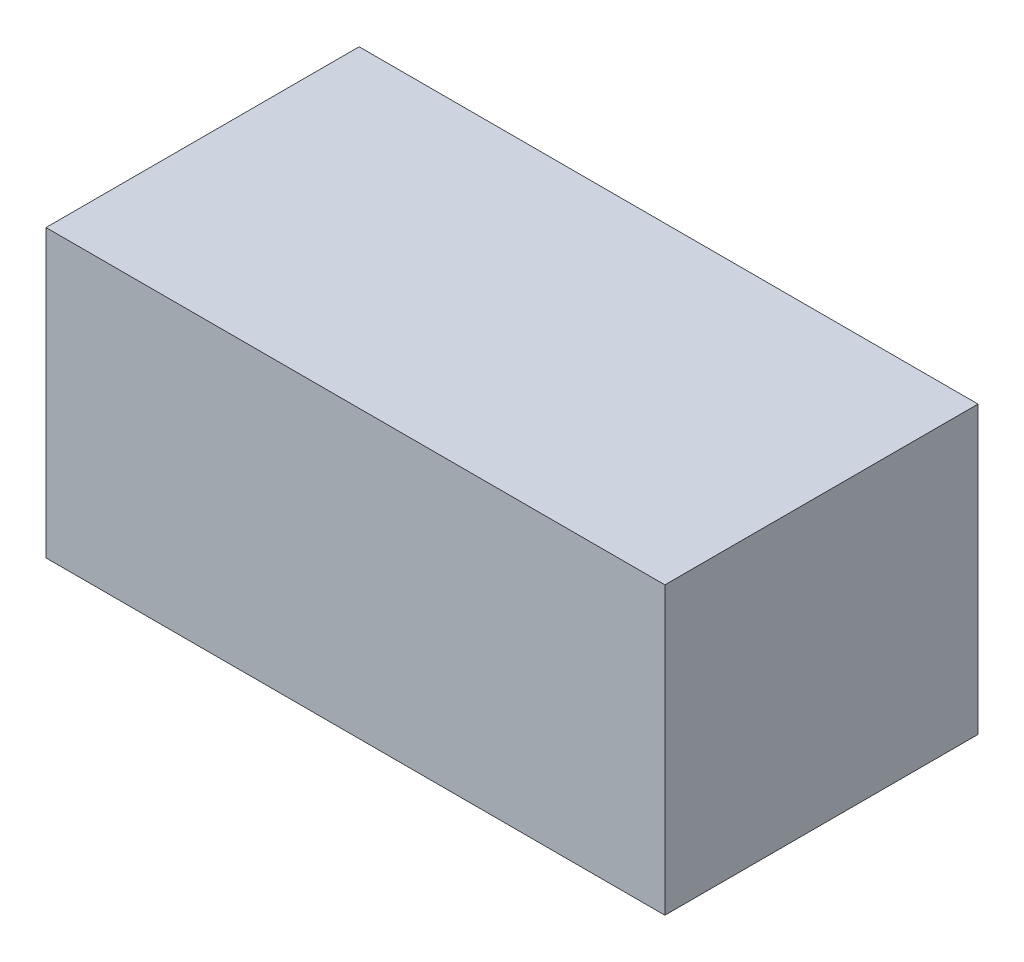
ISO-10303-21;
HEADER;
FILE_DESCRIPTION(('STEP AP214'),'2;1');
FILE_NAME('part.step','',(''),(''),'','','');
FILE_SCHEMA(('AUTOMOTIVE_DESIGN { 1 0 10303 214 1 1 1 1 }'));
ENDSEC;
DATA;
#1=APPLICATION_CONTEXT('core data for automotive mechanical design processes');
#2=APPLICATION_PROTOCOL_DEFINITION('international standard','automotive_design',2000,#1);
#3=PRODUCT_CONTEXT('',#1,'mechanical');
#4=PRODUCT('Part','Part','',(#3));
#5=PRODUCT_RELATED_PRODUCT_CATEGORY('part','',(#4));
#6=PRODUCT_DEFINITION_FORMATION('','',#4);
#7=PRODUCT_DEFINITION_CONTEXT('part definition',#1,'design');
#8=PRODUCT_DEFINITION('design','',#6,#7);
#9=PRODUCT_DEFINITION_SHAPE('','',#8);
#10=(LENGTH_UNIT() NAMED_UNIT(*) SI_UNIT(.MILLI.,.METRE.));
#11=(NAMED_UNIT(*) PLANE_ANGLE_UNIT() SI_UNIT($,.RADIAN.));
#12=(NAMED_UNIT(*) SI_UNIT($,.STERADIAN.) SOLID_ANGLE_UNIT());
#13=UNCERTAINTY_MEASURE_WITH_UNIT(LENGTH_MEASURE(1.E-05),#10,'distance_accuracy_value','');
#14=(GEOMETRIC_REPRESENTATION_CONTEXT(3) GLOBAL_UNCERTAINTY_ASSIGNED_CONTEXT((#13)) GLOBAL_UNIT_ASSIGNED_CONTEXT((#10,
#11,#12)) REPRESENTATION_CONTEXT('',''));
#15=CARTESIAN_POINT('',(0.,0.,0.));
#16=DIRECTION('',(0.,0.,1.));
#17=DIRECTION('',(1.,0.,0.));
#18=AXIS2_PLACEMENT_3D('',#15,#16,#17);
#19=CARTESIAN_POINT('',(-48.0707065,-22.225,48.6421938));
#20=DIRECTION('',(1.,0.,0.));
#21=DIRECTION('',(0.,0.,-1.));
#22=AXIS2_PLACEMENT_3D('',#19,#20,#21);
#23=PLANE('',#22);
#24=DIRECTION('',(0.,-1.,0.));
#25=VECTOR('',#24,1.);
#26=CARTESIAN_POINT('',(-48.0707065,-22.225,0.));
#27=LINE('',#26,#25);
#28=CARTESIAN_POINT('',(-48.0707065,22.225,0.));
#29=VERTEX_POINT('',#28);
#30=CARTESIAN_POINT('',(-48.0707065,-22.225,0.));
#31=VERTEX_POINT('',#30);
#32=EDGE_CURVE('E99',#29,#31,#27,.T.);
#33=ORIENTED_EDGE('',*,*,#32,.T.);
#34=DIRECTION('',(0.,0.,-1.));
#35=VECTOR('',#34,1.);
#36=CARTESIAN_POINT('',(-48.0707065,-22.225,48.6421938));
#37=LINE('',#36,#35);
#38=CARTESIAN_POINT('',(-48.0707065,-22.225,48.6421938));
#39=VERTEX_POINT('',#38);
#40=EDGE_CURVE('E11',#39,#31,#37,.T.);
#41=ORIENTED_EDGE('',*,*,#40,.F.);
#42=DIRECTION('',(0.,-1.,0.));
#43=VECTOR('',#42,1.);
#44=CARTESIAN_POINT('',(-48.0707065,-22.225,48.6421938));
#45=LINE('',#44,#43);
#46=CARTESIAN_POINT('',(-48.0707065,22.225,48.6421938));
#47=VERTEX_POINT('',#46);
#48=EDGE_CURVE('E87',#47,#39,#45,.T.);
#49=ORIENTED_EDGE('',*,*,#48,.F.);
#50=DIRECTION('',(0.,0.,-1.));
#51=VECTOR('',#50,1.);
#52=CARTESIAN_POINT('',(-48.0707065,22.225,48.6421938));
#53=LINE('',#52,#51);
#54=EDGE_CURVE('E95',#47,#29,#53,.T.);
#55=ORIENTED_EDGE('',*,*,#54,.T.);
#56=EDGE_LOOP('',(#33,#41,#49,#55));
#57=FACE_BOUND('',#56,.T.);
#58=ADVANCED_FACE('F36',(#57),#23,.F.);
#59=CARTESIAN_POINT('',(48.0707065,-22.225,48.6421938));
#60=DIRECTION('',(0.,1.,0.));
#61=DIRECTION('',(-1.,0.,0.));
#62=AXIS2_PLACEMENT_3D('',#59,#60,#61);
#63=PLANE('',#62);
#64=DIRECTION('',(1.,0.,0.));
#65=VECTOR('',#64,1.);
#66=CARTESIAN_POINT('',(48.0707065,-22.225,0.));
#67=LINE('',#66,#65);
#68=CARTESIAN_POINT('',(48.0707065,-22.225,0.));
#69=VERTEX_POINT('',#68);
#70=EDGE_CURVE('E91',#31,#69,#67,.T.);
#71=ORIENTED_EDGE('',*,*,#70,.T.);
#72=DIRECTION('',(0.,0.,-1.));
#73=VECTOR('',#72,1.);
#74=CARTESIAN_POINT('',(48.0707065,-22.225,48.6421938));
#75=LINE('',#74,#73);
#76=CARTESIAN_POINT('',(48.0707065,-22.225,48.6421938));
#77=VERTEX_POINT('',#76);
#78=EDGE_CURVE('E44',#77,#69,#75,.T.);
#79=ORIENTED_EDGE('',*,*,#78,.F.);
#80=DIRECTION('',(1.,0.,0.));
#81=VECTOR('',#80,1.);
#82=CARTESIAN_POINT('',(48.0707065,-22.225,48.6421938));
#83=LINE('',#82,#81);
#84=EDGE_CURVE('E82',#39,#77,#83,.T.);
#85=ORIENTED_EDGE('',*,*,#84,.F.);
#86=ORIENTED_EDGE('',*,*,#40,.T.);
#87=EDGE_LOOP('',(#71,#79,#85,#86));
#88=FACE_BOUND('',#87,.T.);
#89=ADVANCED_FACE('F90',(#88),#63,.F.);
#90=CARTESIAN_POINT('',(48.0707065,-22.225,48.6421938));
#91=DIRECTION('',(-1.,0.,0.));
#92=DIRECTION('',(0.,0.,1.));
#93=AXIS2_PLACEMENT_3D('',#90,#91,#92);
#94=PLANE('',#93);
#95=DIRECTION('',(0.,1.,0.));
#96=VECTOR('',#95,1.);
#97=CARTESIAN_POINT('',(48.0707065,-22.225,0.));
#98=LINE('',#97,#96);
#99=CARTESIAN_POINT('',(48.0707065,22.225,0.));
#100=VERTEX_POINT('',#99);
#101=EDGE_CURVE('E69',#69,#100,#98,.T.);
#102=ORIENTED_EDGE('',*,*,#101,.T.);
#103=DIRECTION('',(0.,0.,-1.));
#104=VECTOR('',#103,1.);
#105=CARTESIAN_POINT('',(48.0707065,22.225,48.6421938));
#106=LINE('',#105,#104);
#107=CARTESIAN_POINT('',(48.0707065,22.225,48.6421938));
#108=VERTEX_POINT('',#107);
#109=EDGE_CURVE('E92',#108,#100,#106,.T.);
#110=ORIENTED_EDGE('',*,*,#109,.F.);
#111=DIRECTION('',(0.,1.,0.));
#112=VECTOR('',#111,1.);
#113=CARTESIAN_POINT('',(48.0707065,-22.225,48.6421938));
#114=LINE('',#113,#112);
#115=EDGE_CURVE('E85',#77,#108,#114,.T.);
#116=ORIENTED_EDGE('',*,*,#115,.F.);
#117=ORIENTED_EDGE('',*,*,#78,.T.);
#118=EDGE_LOOP('',(#102,#110,#116,#117));
#119=FACE_BOUND('',#118,.T.);
#120=ADVANCED_FACE('F93',(#119),#94,.F.);
#121=CARTESIAN_POINT('',(48.0707065,22.225,48.6421938));
#122=DIRECTION('',(0.,-1.,0.));
#123=DIRECTION('',(1.,0.,0.));
#124=AXIS2_PLACEMENT_3D('',#121,#122,#123);
#125=PLANE('',#124);
#126=DIRECTION('',(-1.,0.,0.));
#127=VECTOR('',#126,1.);
#128=CARTESIAN_POINT('',(48.0707065,22.225,0.));
#129=LINE('',#128,#127);
#130=EDGE_CURVE('E75',#100,#29,#129,.T.);
#131=ORIENTED_EDGE('',*,*,#130,.T.);
#132=ORIENTED_EDGE('',*,*,#54,.F.);
#133=DIRECTION('',(-1.,0.,0.));
#134=VECTOR('',#133,1.);
#135=CARTESIAN_POINT('',(48.0707065,22.225,48.6421938));
#136=LINE('',#135,#134);
#137=EDGE_CURVE('E52',#108,#47,#136,.T.);
#138=ORIENTED_EDGE('',*,*,#137,.F.);
#139=ORIENTED_EDGE('',*,*,#109,.T.);
#140=EDGE_LOOP('',(#131,#132,#138,#139));
#141=FACE_BOUND('',#140,.T.);
#142=ADVANCED_FACE('F106',(#141),#125,.F.);
#143=CARTESIAN_POINT('',(0.,0.,48.6421938));
#144=DIRECTION('',(0.,0.,1.));
#145=DIRECTION('',(1.,0.,0.));
#146=AXIS2_PLACEMENT_3D('',#143,#144,#145);
#147=PLANE('',#146);
#148=ORIENTED_EDGE('',*,*,#48,.T.);
#149=ORIENTED_EDGE('',*,*,#84,.T.);
#150=ORIENTED_EDGE('',*,*,#115,.T.);
#151=ORIENTED_EDGE('',*,*,#137,.T.);
#152=EDGE_LOOP('',(#148,#149,#150,#151));
#153=FACE_BOUND('',#152,.T.);
#154=ADVANCED_FACE('F83',(#153),#147,.T.);
#155=CARTESIAN_POINT('',(0.,0.,0.));
#156=DIRECTION('',(0.,0.,1.));
#157=DIRECTION('',(1.,0.,0.));
#158=AXIS2_PLACEMENT_3D('',#155,#156,#157);
#159=PLANE('',#158);
#160=ORIENTED_EDGE('',*,*,#32,.F.);
#161=ORIENTED_EDGE('',*,*,#130,.F.);
#162=ORIENTED_EDGE('',*,*,#101,.F.);
#163=ORIENTED_EDGE('',*,*,#70,.F.);
#164=EDGE_LOOP('',(#160,#161,#162,#163));
#165=FACE_BOUND('',#164,.T.);
#166=ADVANCED_FACE('F109',(#165),#159,.F.);
#167=CLOSED_SHELL('',(#58,#89,#120,#142,#154,#166));
#168=MANIFOLD_SOLID_BREP('B2',#167);
#169=ADVANCED_BREP_SHAPE_REPRESENTATION('',(#18,#168),#14);
#170=SHAPE_DEFINITION_REPRESENTATION(#9,#169);
ENDSEC;
END-ISO-10303-21;
